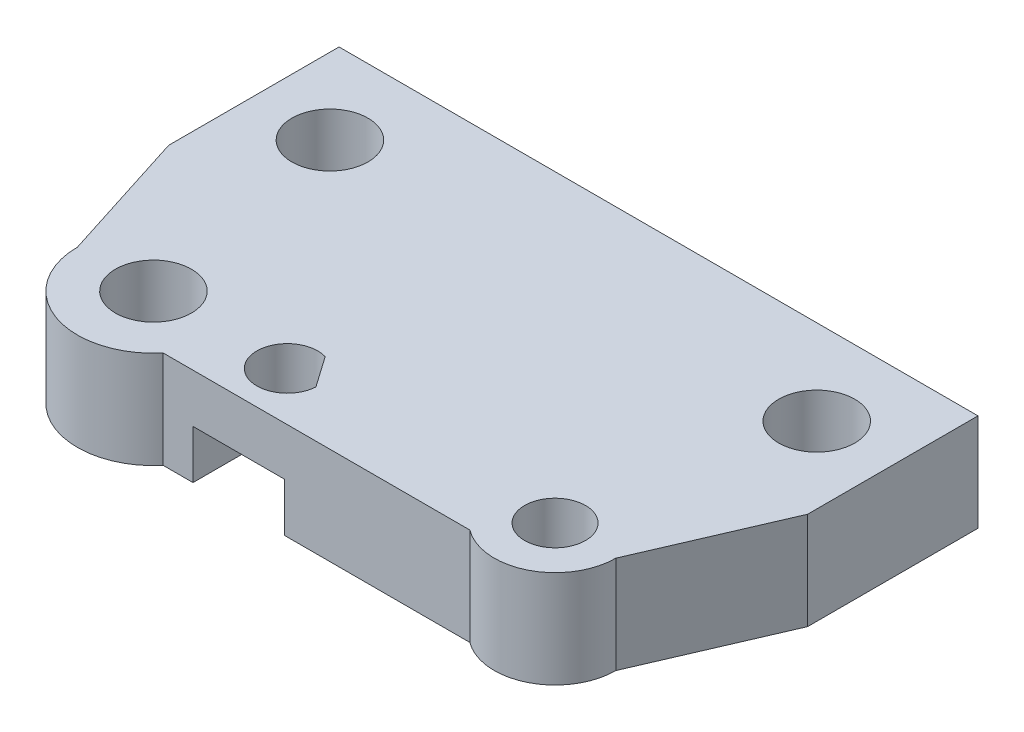
ISO-10303-21;
HEADER;
FILE_DESCRIPTION(('STEP AP214'),'2;1');
FILE_NAME('part.step','',(''),(''),'','','');
FILE_SCHEMA(('AUTOMOTIVE_DESIGN { 1 0 10303 214 1 1 1 1 }'));
ENDSEC;
DATA;
#1=APPLICATION_CONTEXT('core data for automotive mechanical design processes');
#2=APPLICATION_PROTOCOL_DEFINITION('international standard','automotive_design',2000,#1);
#3=PRODUCT_CONTEXT('',#1,'mechanical');
#4=PRODUCT('Part','Part','',(#3));
#5=PRODUCT_RELATED_PRODUCT_CATEGORY('part','',(#4));
#6=PRODUCT_DEFINITION_FORMATION('','',#4);
#7=PRODUCT_DEFINITION_CONTEXT('part definition',#1,'design');
#8=PRODUCT_DEFINITION('design','',#6,#7);
#9=PRODUCT_DEFINITION_SHAPE('','',#8);
#10=(LENGTH_UNIT() NAMED_UNIT(*) SI_UNIT(.MILLI.,.METRE.));
#11=(NAMED_UNIT(*) PLANE_ANGLE_UNIT() SI_UNIT($,.RADIAN.));
#12=(NAMED_UNIT(*) SI_UNIT($,.STERADIAN.) SOLID_ANGLE_UNIT());
#13=UNCERTAINTY_MEASURE_WITH_UNIT(LENGTH_MEASURE(1.E-05),#10,'distance_accuracy_value','');
#14=(GEOMETRIC_REPRESENTATION_CONTEXT(3) GLOBAL_UNCERTAINTY_ASSIGNED_CONTEXT((#13)) GLOBAL_UNIT_ASSIGNED_CONTEXT((#10,
#11,#12)) REPRESENTATION_CONTEXT('',''));
#15=CARTESIAN_POINT('',(0.,0.,0.));
#16=DIRECTION('',(0.,0.,1.));
#17=DIRECTION('',(1.,0.,0.));
#18=AXIS2_PLACEMENT_3D('',#15,#16,#17);
#19=CARTESIAN_POINT('',(13.97,-10.16,0.));
#20=DIRECTION('',(0.,1.,0.));
#21=DIRECTION('',(0.,0.,1.));
#22=AXIS2_PLACEMENT_3D('',#19,#20,#21);
#23=CYLINDRICAL_SURFACE('',#22,3.175);
#24=CARTESIAN_POINT('',(13.97,-5.08,0.));
#25=DIRECTION('',(0.,-1.,0.));
#26=DIRECTION('',(0.,0.,-1.));
#27=AXIS2_PLACEMENT_3D('',#24,#25,#26);
#28=CIRCLE('',#27,3.175);
#29=CARTESIAN_POINT('',(14.8785625140549,-5.08,-3.04222602021188));
#30=VERTEX_POINT('',#29);
#31=CARTESIAN_POINT('',(17.1395040232334,-5.08,0.186733089481814));
#32=VERTEX_POINT('',#31);
#33=EDGE_CURVE('E65',#30,#32,#28,.F.);
#34=ORIENTED_EDGE('',*,*,#33,.F.);
#35=DIRECTION('',(0.,1.,0.));
#36=VECTOR('',#35,1.);
#37=CARTESIAN_POINT('',(14.8785625140549,-10.16,-3.04222602021188));
#38=LINE('',#37,#36);
#39=CARTESIAN_POINT('',(14.8785625140549,0.,-3.04222602021188));
#40=VERTEX_POINT('',#39);
#41=EDGE_CURVE('E200',#30,#40,#38,.T.);
#42=ORIENTED_EDGE('',*,*,#41,.T.);
#43=CARTESIAN_POINT('',(13.97,0.,0.));
#44=DIRECTION('',(0.,1.,0.));
#45=DIRECTION('',(0.,0.,-1.));
#46=AXIS2_PLACEMENT_3D('',#43,#44,#45);
#47=CIRCLE('',#46,3.175);
#48=CARTESIAN_POINT('',(17.1395040232334,0.,0.186733089481812));
#49=VERTEX_POINT('',#48);
#50=EDGE_CURVE('E191',#40,#49,#47,.T.);
#51=ORIENTED_EDGE('',*,*,#50,.T.);
#52=DIRECTION('',(0.,1.,0.));
#53=VECTOR('',#52,1.);
#54=CARTESIAN_POINT('',(17.1395040232334,-10.16,0.186733089481814));
#55=LINE('',#54,#53);
#56=EDGE_CURVE('E199',#32,#49,#55,.T.);
#57=ORIENTED_EDGE('',*,*,#56,.F.);
#58=EDGE_LOOP('',(#34,#42,#51,#57));
#59=FACE_BOUND('',#58,.T.);
#60=ADVANCED_FACE('F43',(#59),#23,.F.);
#61=CARTESIAN_POINT('',(17.1395040232334,-10.16,0.186733089481814));
#62=DIRECTION('',(0.819152044288991,0.,-0.573576436351047));
#63=DIRECTION('',(-0.573576436351047,0.,-0.819152044288991));
#64=AXIS2_PLACEMENT_3D('',#61,#62,#63);
#65=PLANE('',#64);
#66=DIRECTION('',(-0.573576436351047,0.,-0.819152044288991));
#67=VECTOR('',#66,1.);
#68=CARTESIAN_POINT('',(17.1395040232334,-5.08,0.186733089481814));
#69=LINE('',#68,#67);
#70=EDGE_CURVE('E11',#32,#30,#69,.T.);
#71=ORIENTED_EDGE('',*,*,#70,.F.);
#72=ORIENTED_EDGE('',*,*,#56,.T.);
#73=DIRECTION('',(-0.573576436351047,0.,-0.819152044288991));
#74=VECTOR('',#73,1.);
#75=CARTESIAN_POINT('',(17.1395040232334,0.,0.186733089481814));
#76=LINE('',#75,#74);
#77=EDGE_CURVE('E195',#49,#40,#76,.T.);
#78=ORIENTED_EDGE('',*,*,#77,.T.);
#79=ORIENTED_EDGE('',*,*,#41,.F.);
#80=EDGE_LOOP('',(#71,#72,#78,#79));
#81=FACE_BOUND('',#80,.T.);
#82=ADVANCED_FACE('F375',(#81),#65,.F.);
#83=CARTESIAN_POINT('',(41.91,-10.16,0.));
#84=DIRECTION('',(0.,1.,0.));
#85=DIRECTION('',(0.,0.,1.));
#86=AXIS2_PLACEMENT_3D('',#83,#84,#85);
#87=CYLINDRICAL_SURFACE('',#86,6.35);
#88=CARTESIAN_POINT('',(41.91,0.,0.));
#89=DIRECTION('',(0.,1.,0.));
#90=DIRECTION('',(0.,0.,-1.));
#91=AXIS2_PLACEMENT_3D('',#88,#89,#90);
#92=CIRCLE('',#91,6.35);
#93=CARTESIAN_POINT('',(38.1,0.,5.08));
#94=VERTEX_POINT('',#93);
#95=CARTESIAN_POINT('',(48.26,0.,0.));
#96=VERTEX_POINT('',#95);
#97=EDGE_CURVE('E234',#94,#96,#92,.T.);
#98=ORIENTED_EDGE('',*,*,#97,.F.);
#99=DIRECTION('',(0.,1.,0.));
#100=VECTOR('',#99,1.);
#101=CARTESIAN_POINT('',(38.1,-10.16,5.08));
#102=LINE('',#101,#100);
#103=CARTESIAN_POINT('',(38.1,-10.16,5.08));
#104=VERTEX_POINT('',#103);
#105=EDGE_CURVE('E52',#104,#94,#102,.T.);
#106=ORIENTED_EDGE('',*,*,#105,.F.);
#107=CARTESIAN_POINT('',(41.91,-10.16,0.));
#108=DIRECTION('',(0.,1.,0.));
#109=DIRECTION('',(0.,0.,-1.));
#110=AXIS2_PLACEMENT_3D('',#107,#108,#109);
#111=CIRCLE('',#110,6.35);
#112=CARTESIAN_POINT('',(48.26,-10.16,0.));
#113=VERTEX_POINT('',#112);
#114=EDGE_CURVE('E238',#104,#113,#111,.T.);
#115=ORIENTED_EDGE('',*,*,#114,.T.);
#116=DIRECTION('',(0.,1.,0.));
#117=VECTOR('',#116,1.);
#118=CARTESIAN_POINT('',(48.26,-10.16,0.));
#119=LINE('',#118,#117);
#120=EDGE_CURVE('E272',#113,#96,#119,.T.);
#121=ORIENTED_EDGE('',*,*,#120,.T.);
#122=EDGE_LOOP('',(#98,#106,#115,#121));
#123=FACE_BOUND('',#122,.T.);
#124=ADVANCED_FACE('F45',(#123),#87,.T.);
#125=CARTESIAN_POINT('',(38.1,-10.16,5.08));
#126=DIRECTION('',(0.,0.,1.));
#127=DIRECTION('',(1.,0.,0.));
#128=AXIS2_PLACEMENT_3D('',#125,#126,#127);
#129=PLANE('',#128);
#130=DIRECTION('',(0.,-1.,0.));
#131=VECTOR('',#130,1.);
#132=CARTESIAN_POINT('',(9.2075,-5.08,5.07999999999999));
#133=LINE('',#132,#131);
#134=CARTESIAN_POINT('',(9.2075,-5.08,5.07999999999999));
#135=VERTEX_POINT('',#134);
#136=CARTESIAN_POINT('',(9.2075,-10.16,5.07999999999999));
#137=VERTEX_POINT('',#136);
#138=EDGE_CURVE('E184',#135,#137,#133,.T.);
#139=ORIENTED_EDGE('',*,*,#138,.F.);
#140=DIRECTION('',(-1.,0.,0.));
#141=VECTOR('',#140,1.);
#142=CARTESIAN_POINT('',(9.2075,-5.08,5.07999999999999));
#143=LINE('',#142,#141);
#144=CARTESIAN_POINT('',(18.7325,-5.08,5.07999999999999));
#145=VERTEX_POINT('',#144);
#146=EDGE_CURVE('E161',#145,#135,#143,.T.);
#147=ORIENTED_EDGE('',*,*,#146,.F.);
#148=DIRECTION('',(0.,-1.,0.));
#149=VECTOR('',#148,1.);
#150=CARTESIAN_POINT('',(18.7325,-5.08,5.07999999999999));
#151=LINE('',#150,#149);
#152=CARTESIAN_POINT('',(18.7325,-10.16,5.07999999999999));
#153=VERTEX_POINT('',#152);
#154=EDGE_CURVE('E151',#145,#153,#151,.T.);
#155=ORIENTED_EDGE('',*,*,#154,.T.);
#156=DIRECTION('',(1.,0.,0.));
#157=VECTOR('',#156,1.);
#158=CARTESIAN_POINT('',(38.1,-10.16,5.08));
#159=LINE('',#158,#157);
#160=EDGE_CURVE('E267',#153,#104,#159,.T.);
#161=ORIENTED_EDGE('',*,*,#160,.T.);
#162=ORIENTED_EDGE('',*,*,#105,.T.);
#163=DIRECTION('',(1.,0.,0.));
#164=VECTOR('',#163,1.);
#165=CARTESIAN_POINT('',(38.1,0.,5.08));
#166=LINE('',#165,#164);
#167=CARTESIAN_POINT('',(6.09897583615479,0.,5.07999999999999));
#168=VERTEX_POINT('',#167);
#169=EDGE_CURVE('E243',#168,#94,#166,.T.);
#170=ORIENTED_EDGE('',*,*,#169,.F.);
#171=DIRECTION('',(0.,1.,0.));
#172=VECTOR('',#171,1.);
#173=CARTESIAN_POINT('',(6.09897583615479,-10.16,5.07999999999999));
#174=LINE('',#173,#172);
#175=CARTESIAN_POINT('',(6.09897583615479,-10.16,5.07999999999999));
#176=VERTEX_POINT('',#175);
#177=EDGE_CURVE('E305',#176,#168,#174,.T.);
#178=ORIENTED_EDGE('',*,*,#177,.F.);
#179=EDGE_CURVE('E268',#176,#137,#159,.T.);
#180=ORIENTED_EDGE('',*,*,#179,.T.);
#181=EDGE_LOOP('',(#139,#147,#155,#161,#162,#170,#178,#180));
#182=FACE_BOUND('',#181,.T.);
#183=ADVANCED_FACE('F338',(#182),#129,.T.);
#184=CARTESIAN_POINT('',(0.,-10.16,0.));
#185=DIRECTION('',(0.,1.,0.));
#186=DIRECTION('',(0.,0.,1.));
#187=AXIS2_PLACEMENT_3D('',#184,#185,#186);
#188=CYLINDRICAL_SURFACE('',#187,7.9375);
#189=CARTESIAN_POINT('',(0.,0.,0.));
#190=DIRECTION('',(0.,1.,0.));
#191=DIRECTION('',(0.,0.,-1.));
#192=AXIS2_PLACEMENT_3D('',#189,#190,#191);
#193=CIRCLE('',#192,7.9375);
#194=CARTESIAN_POINT('',(-7.9375,0.,0.));
#195=VERTEX_POINT('',#194);
#196=EDGE_CURVE('E296',#195,#168,#193,.T.);
#197=ORIENTED_EDGE('',*,*,#196,.F.);
#198=DIRECTION('',(0.,1.,0.));
#199=VECTOR('',#198,1.);
#200=CARTESIAN_POINT('',(-7.9375,-10.16,0.));
#201=LINE('',#200,#199);
#202=CARTESIAN_POINT('',(-7.9375,-10.16,0.));
#203=VERTEX_POINT('',#202);
#204=EDGE_CURVE('E308',#203,#195,#201,.T.);
#205=ORIENTED_EDGE('',*,*,#204,.F.);
#206=CARTESIAN_POINT('',(0.,-10.16,0.));
#207=DIRECTION('',(0.,1.,0.));
#208=DIRECTION('',(0.,0.,-1.));
#209=AXIS2_PLACEMENT_3D('',#206,#207,#208);
#210=CIRCLE('',#209,7.9375);
#211=EDGE_CURVE('E263',#203,#176,#210,.T.);
#212=ORIENTED_EDGE('',*,*,#211,.T.);
#213=ORIENTED_EDGE('',*,*,#177,.T.);
#214=EDGE_LOOP('',(#197,#205,#212,#213));
#215=FACE_BOUND('',#214,.T.);
#216=ADVANCED_FACE('F361',(#215),#188,.T.);
#217=CARTESIAN_POINT('',(-7.9375,-10.16,0.));
#218=DIRECTION('',(-0.952925780013262,0.,0.303203657276947));
#219=DIRECTION('',(0.303203657276947,0.,0.952925780013262));
#220=AXIS2_PLACEMENT_3D('',#217,#218,#219);
#221=PLANE('',#220);
#222=DIRECTION('',(0.303203657276947,0.,0.952925780013262));
#223=VECTOR('',#222,1.);
#224=CARTESIAN_POINT('',(-7.9375,0.,0.));
#225=LINE('',#224,#223);
#226=CARTESIAN_POINT('',(-12.3825,0.,-13.97));
#227=VERTEX_POINT('',#226);
#228=EDGE_CURVE('E292',#227,#195,#225,.T.);
#229=ORIENTED_EDGE('',*,*,#228,.F.);
#230=DIRECTION('',(0.,1.,0.));
#231=VECTOR('',#230,1.);
#232=CARTESIAN_POINT('',(-12.3825,-10.16,-13.97));
#233=LINE('',#232,#231);
#234=CARTESIAN_POINT('',(-12.3825,-10.16,-13.97));
#235=VERTEX_POINT('',#234);
#236=EDGE_CURVE('E311',#235,#227,#233,.T.);
#237=ORIENTED_EDGE('',*,*,#236,.F.);
#238=DIRECTION('',(0.303203657276947,0.,0.952925780013262));
#239=VECTOR('',#238,1.);
#240=CARTESIAN_POINT('',(-7.9375,-10.16,0.));
#241=LINE('',#240,#239);
#242=EDGE_CURVE('E259',#235,#203,#241,.T.);
#243=ORIENTED_EDGE('',*,*,#242,.T.);
#244=ORIENTED_EDGE('',*,*,#204,.T.);
#245=EDGE_LOOP('',(#229,#237,#243,#244));
#246=FACE_BOUND('',#245,.T.);
#247=ADVANCED_FACE('F358',(#246),#221,.T.);
#248=CARTESIAN_POINT('',(-12.3825,-10.16,-31.75));
#249=DIRECTION('',(-1.,0.,0.));
#250=DIRECTION('',(0.,0.,1.));
#251=AXIS2_PLACEMENT_3D('',#248,#249,#250);
#252=PLANE('',#251);
#253=DIRECTION('',(0.,0.,1.));
#254=VECTOR('',#253,1.);
#255=CARTESIAN_POINT('',(-12.3825,0.,-31.75));
#256=LINE('',#255,#254);
#257=CARTESIAN_POINT('',(-12.3825,0.,-31.75));
#258=VERTEX_POINT('',#257);
#259=EDGE_CURVE('E288',#258,#227,#256,.T.);
#260=ORIENTED_EDGE('',*,*,#259,.F.);
#261=DIRECTION('',(0.,1.,0.));
#262=VECTOR('',#261,1.);
#263=CARTESIAN_POINT('',(-12.3825,-10.16,-31.75));
#264=LINE('',#263,#262);
#265=CARTESIAN_POINT('',(-12.3825,-10.16,-31.75));
#266=VERTEX_POINT('',#265);
#267=EDGE_CURVE('E314',#266,#258,#264,.T.);
#268=ORIENTED_EDGE('',*,*,#267,.F.);
#269=DIRECTION('',(0.,0.,1.));
#270=VECTOR('',#269,1.);
#271=CARTESIAN_POINT('',(-12.3825,-10.16,-31.75));
#272=LINE('',#271,#270);
#273=EDGE_CURVE('E255',#266,#235,#272,.T.);
#274=ORIENTED_EDGE('',*,*,#273,.T.);
#275=ORIENTED_EDGE('',*,*,#236,.T.);
#276=EDGE_LOOP('',(#260,#268,#274,#275));
#277=FACE_BOUND('',#276,.T.);
#278=ADVANCED_FACE('F354',(#277),#252,.T.);
#279=CARTESIAN_POINT('',(54.2925,-10.16,-31.75));
#280=DIRECTION('',(0.,0.,-1.));
#281=DIRECTION('',(-1.,0.,0.));
#282=AXIS2_PLACEMENT_3D('',#279,#280,#281);
#283=PLANE('',#282);
#284=DIRECTION('',(-1.,0.,0.));
#285=VECTOR('',#284,1.);
#286=CARTESIAN_POINT('',(54.2925,0.,-31.75));
#287=LINE('',#286,#285);
#288=CARTESIAN_POINT('',(54.2925,0.,-31.75));
#289=VERTEX_POINT('',#288);
#290=EDGE_CURVE('E284',#289,#258,#287,.T.);
#291=ORIENTED_EDGE('',*,*,#290,.F.);
#292=DIRECTION('',(0.,1.,0.));
#293=VECTOR('',#292,1.);
#294=CARTESIAN_POINT('',(54.2925,-10.16,-31.75));
#295=LINE('',#294,#293);
#296=CARTESIAN_POINT('',(54.2925,-10.16,-31.75));
#297=VERTEX_POINT('',#296);
#298=EDGE_CURVE('E317',#297,#289,#295,.T.);
#299=ORIENTED_EDGE('',*,*,#298,.F.);
#300=DIRECTION('',(-1.,0.,0.));
#301=VECTOR('',#300,1.);
#302=CARTESIAN_POINT('',(54.2925,-10.16,-31.75));
#303=LINE('',#302,#301);
#304=EDGE_CURVE('E251',#297,#266,#303,.T.);
#305=ORIENTED_EDGE('',*,*,#304,.T.);
#306=ORIENTED_EDGE('',*,*,#267,.T.);
#307=EDGE_LOOP('',(#291,#299,#305,#306));
#308=FACE_BOUND('',#307,.T.);
#309=ADVANCED_FACE('F352',(#308),#283,.T.);
#310=CARTESIAN_POINT('',(54.2925,-10.16,-31.75));
#311=DIRECTION('',(1.,0.,0.));
#312=DIRECTION('',(0.,0.,-1.));
#313=AXIS2_PLACEMENT_3D('',#310,#311,#312);
#314=PLANE('',#313);
#315=DIRECTION('',(0.,0.,-1.));
#316=VECTOR('',#315,1.);
#317=CARTESIAN_POINT('',(54.2925,0.,-31.75));
#318=LINE('',#317,#316);
#319=CARTESIAN_POINT('',(54.2925,0.,-13.97));
#320=VERTEX_POINT('',#319);
#321=EDGE_CURVE('E280',#320,#289,#318,.T.);
#322=ORIENTED_EDGE('',*,*,#321,.F.);
#323=DIRECTION('',(0.,1.,0.));
#324=VECTOR('',#323,1.);
#325=CARTESIAN_POINT('',(54.2925,-10.16,-13.97));
#326=LINE('',#325,#324);
#327=CARTESIAN_POINT('',(54.2925,-10.16,-13.97));
#328=VERTEX_POINT('',#327);
#329=EDGE_CURVE('E320',#328,#320,#326,.T.);
#330=ORIENTED_EDGE('',*,*,#329,.F.);
#331=DIRECTION('',(0.,0.,-1.));
#332=VECTOR('',#331,1.);
#333=CARTESIAN_POINT('',(54.2925,-10.16,-31.75));
#334=LINE('',#333,#332);
#335=EDGE_CURVE('E247',#328,#297,#334,.T.);
#336=ORIENTED_EDGE('',*,*,#335,.T.);
#337=ORIENTED_EDGE('',*,*,#298,.T.);
#338=EDGE_LOOP('',(#322,#330,#336,#337));
#339=FACE_BOUND('',#338,.T.);
#340=ADVANCED_FACE('F348',(#339),#314,.T.);
#341=CARTESIAN_POINT('',(48.26,-10.16,0.));
#342=DIRECTION('',(0.91806235353619,0.,0.396436016299719));
#343=DIRECTION('',(0.396436016299719,0.,-0.91806235353619));
#344=AXIS2_PLACEMENT_3D('',#341,#342,#343);
#345=PLANE('',#344);
#346=DIRECTION('',(0.396436016299719,0.,-0.91806235353619));
#347=VECTOR('',#346,1.);
#348=CARTESIAN_POINT('',(48.26,0.,0.));
#349=LINE('',#348,#347);
#350=EDGE_CURVE('E276',#96,#320,#349,.T.);
#351=ORIENTED_EDGE('',*,*,#350,.F.);
#352=ORIENTED_EDGE('',*,*,#120,.F.);
#353=DIRECTION('',(0.396436016299719,0.,-0.91806235353619));
#354=VECTOR('',#353,1.);
#355=CARTESIAN_POINT('',(48.26,-10.16,0.));
#356=LINE('',#355,#354);
#357=EDGE_CURVE('E242',#113,#328,#356,.T.);
#358=ORIENTED_EDGE('',*,*,#357,.T.);
#359=ORIENTED_EDGE('',*,*,#329,.T.);
#360=EDGE_LOOP('',(#351,#352,#358,#359));
#361=FACE_BOUND('',#360,.T.);
#362=ADVANCED_FACE('F330',(#361),#345,.T.);
#363=CARTESIAN_POINT('',(41.91,-10.16,0.));
#364=DIRECTION('',(0.,-1.,0.));
#365=DIRECTION('',(0.,0.,-1.));
#366=AXIS2_PLACEMENT_3D('',#363,#364,#365);
#367=PLANE('',#366);
#368=DIRECTION('',(0.,0.,-1.));
#369=VECTOR('',#368,1.);
#370=CARTESIAN_POINT('',(9.2075,-10.16,0.));
#371=LINE('',#370,#369);
#372=CARTESIAN_POINT('',(9.2075,-10.16,0.));
#373=VERTEX_POINT('',#372);
#374=EDGE_CURVE('E166',#137,#373,#371,.T.);
#375=ORIENTED_EDGE('',*,*,#374,.F.);
#376=ORIENTED_EDGE('',*,*,#179,.F.);
#377=ORIENTED_EDGE('',*,*,#211,.F.);
#378=ORIENTED_EDGE('',*,*,#242,.F.);
#379=ORIENTED_EDGE('',*,*,#273,.F.);
#380=ORIENTED_EDGE('',*,*,#304,.F.);
#381=ORIENTED_EDGE('',*,*,#335,.F.);
#382=ORIENTED_EDGE('',*,*,#357,.F.);
#383=ORIENTED_EDGE('',*,*,#114,.F.);
#384=ORIENTED_EDGE('',*,*,#160,.F.);
#385=DIRECTION('',(0.,0.,1.));
#386=VECTOR('',#385,1.);
#387=CARTESIAN_POINT('',(18.7325,-10.16,5.07999999999999));
#388=LINE('',#387,#386);
#389=CARTESIAN_POINT('',(18.7325,-10.16,0.));
#390=VERTEX_POINT('',#389);
#391=EDGE_CURVE('E170',#390,#153,#388,.T.);
#392=ORIENTED_EDGE('',*,*,#391,.F.);
#393=CARTESIAN_POINT('',(13.97,-10.16,0.));
#394=DIRECTION('',(0.,-1.,0.));
#395=DIRECTION('',(0.,0.,-1.));
#396=AXIS2_PLACEMENT_3D('',#393,#394,#395);
#397=CIRCLE('',#396,4.7625);
#398=EDGE_CURVE('E59',#373,#390,#397,.T.);
#399=ORIENTED_EDGE('',*,*,#398,.F.);
#400=EDGE_LOOP('',(#375,#376,#377,#378,#379,#380,#381,#382,#383,#384,#392,#399));
#401=FACE_BOUND('',#400,.T.);
#402=CARTESIAN_POINT('',(-4.445,-10.16,-22.86));
#403=DIRECTION('',(0.,1.,0.));
#404=DIRECTION('',(0.,0.,1.));
#405=AXIS2_PLACEMENT_3D('',#402,#403,#404);
#406=CIRCLE('',#405,3.96875);
#407=CARTESIAN_POINT('',(-4.445,-10.16,-18.89125));
#408=VERTEX_POINT('',#407);
#409=EDGE_CURVE('E206',#408,#408,#406,.T.);
#410=ORIENTED_EDGE('',*,*,#409,.T.);
#411=EDGE_LOOP('',(#410));
#412=FACE_BOUND('',#411,.T.);
#413=CARTESIAN_POINT('',(46.355,-10.16,-22.86));
#414=DIRECTION('',(0.,1.,0.));
#415=DIRECTION('',(0.,0.,1.));
#416=AXIS2_PLACEMENT_3D('',#413,#414,#415);
#417=CIRCLE('',#416,3.96875000000001);
#418=CARTESIAN_POINT('',(46.355,-10.16,-18.89125));
#419=VERTEX_POINT('',#418);
#420=EDGE_CURVE('E214',#419,#419,#417,.T.);
#421=ORIENTED_EDGE('',*,*,#420,.T.);
#422=EDGE_LOOP('',(#421));
#423=FACE_BOUND('',#422,.T.);
#424=CARTESIAN_POINT('',(41.91,-10.16,0.));
#425=DIRECTION('',(0.,1.,0.));
#426=DIRECTION('',(0.,0.,1.));
#427=AXIS2_PLACEMENT_3D('',#424,#425,#426);
#428=CIRCLE('',#427,3.175);
#429=CARTESIAN_POINT('',(41.91,-10.16,3.175));
#430=VERTEX_POINT('',#429);
#431=EDGE_CURVE('E222',#430,#430,#428,.T.);
#432=ORIENTED_EDGE('',*,*,#431,.T.);
#433=EDGE_LOOP('',(#432));
#434=FACE_BOUND('',#433,.T.);
#435=CARTESIAN_POINT('',(0.,-10.16,0.));
#436=DIRECTION('',(0.,1.,0.));
#437=DIRECTION('',(0.,0.,1.));
#438=AXIS2_PLACEMENT_3D('',#435,#436,#437);
#439=CIRCLE('',#438,3.96875);
#440=CARTESIAN_POINT('',(0.,-10.16,3.96875));
#441=VERTEX_POINT('',#440);
#442=EDGE_CURVE('E230',#441,#441,#439,.T.);
#443=ORIENTED_EDGE('',*,*,#442,.T.);
#444=EDGE_LOOP('',(#443));
#445=FACE_BOUND('',#444,.T.);
#446=ADVANCED_FACE('F342',(#401,#412,#423,#434,#445),#367,.T.);
#447=CARTESIAN_POINT('',(41.91,0.,0.));
#448=DIRECTION('',(0.,-1.,0.));
#449=DIRECTION('',(0.,0.,-1.));
#450=AXIS2_PLACEMENT_3D('',#447,#448,#449);
#451=PLANE('',#450);
#452=ORIENTED_EDGE('',*,*,#77,.F.);
#453=ORIENTED_EDGE('',*,*,#50,.F.);
#454=EDGE_LOOP('',(#452,#453));
#455=FACE_BOUND('',#454,.T.);
#456=CARTESIAN_POINT('',(-4.445,0.,-22.86));
#457=DIRECTION('',(0.,1.,0.));
#458=DIRECTION('',(0.,0.,1.));
#459=AXIS2_PLACEMENT_3D('',#456,#457,#458);
#460=CIRCLE('',#459,3.96875);
#461=CARTESIAN_POINT('',(-4.445,0.,-18.89125));
#462=VERTEX_POINT('',#461);
#463=EDGE_CURVE('E203',#462,#462,#460,.T.);
#464=ORIENTED_EDGE('',*,*,#463,.F.);
#465=EDGE_LOOP('',(#464));
#466=FACE_BOUND('',#465,.T.);
#467=CARTESIAN_POINT('',(46.355,0.,-22.86));
#468=DIRECTION('',(0.,1.,0.));
#469=DIRECTION('',(0.,0.,1.));
#470=AXIS2_PLACEMENT_3D('',#467,#468,#469);
#471=CIRCLE('',#470,3.96875000000001);
#472=CARTESIAN_POINT('',(46.355,0.,-18.89125));
#473=VERTEX_POINT('',#472);
#474=EDGE_CURVE('E210',#473,#473,#471,.T.);
#475=ORIENTED_EDGE('',*,*,#474,.F.);
#476=EDGE_LOOP('',(#475));
#477=FACE_BOUND('',#476,.T.);
#478=CARTESIAN_POINT('',(41.91,0.,0.));
#479=DIRECTION('',(0.,1.,0.));
#480=DIRECTION('',(0.,0.,1.));
#481=AXIS2_PLACEMENT_3D('',#478,#479,#480);
#482=CIRCLE('',#481,3.175);
#483=CARTESIAN_POINT('',(41.91,0.,3.175));
#484=VERTEX_POINT('',#483);
#485=EDGE_CURVE('E218',#484,#484,#482,.T.);
#486=ORIENTED_EDGE('',*,*,#485,.F.);
#487=EDGE_LOOP('',(#486));
#488=FACE_BOUND('',#487,.T.);
#489=CARTESIAN_POINT('',(0.,0.,0.));
#490=DIRECTION('',(0.,1.,0.));
#491=DIRECTION('',(0.,0.,1.));
#492=AXIS2_PLACEMENT_3D('',#489,#490,#491);
#493=CIRCLE('',#492,3.96875);
#494=CARTESIAN_POINT('',(0.,0.,3.96875));
#495=VERTEX_POINT('',#494);
#496=EDGE_CURVE('E226',#495,#495,#493,.T.);
#497=ORIENTED_EDGE('',*,*,#496,.F.);
#498=EDGE_LOOP('',(#497));
#499=FACE_BOUND('',#498,.T.);
#500=ORIENTED_EDGE('',*,*,#97,.T.);
#501=ORIENTED_EDGE('',*,*,#350,.T.);
#502=ORIENTED_EDGE('',*,*,#321,.T.);
#503=ORIENTED_EDGE('',*,*,#290,.T.);
#504=ORIENTED_EDGE('',*,*,#259,.T.);
#505=ORIENTED_EDGE('',*,*,#228,.T.);
#506=ORIENTED_EDGE('',*,*,#196,.T.);
#507=ORIENTED_EDGE('',*,*,#169,.T.);
#508=EDGE_LOOP('',(#500,#501,#502,#503,#504,#505,#506,#507));
#509=FACE_BOUND('',#508,.T.);
#510=ADVANCED_FACE('F333',(#455,#466,#477,#488,#499,#509),#451,.F.);
#511=CARTESIAN_POINT('',(0.,-10.16,0.));
#512=DIRECTION('',(0.,1.,0.));
#513=DIRECTION('',(0.,0.,1.));
#514=AXIS2_PLACEMENT_3D('',#511,#512,#513);
#515=CYLINDRICAL_SURFACE('',#514,3.96875);
#516=ORIENTED_EDGE('',*,*,#442,.F.);
#517=EDGE_LOOP('',(#516));
#518=FACE_BOUND('',#517,.T.);
#519=ORIENTED_EDGE('',*,*,#496,.T.);
#520=EDGE_LOOP('',(#519));
#521=FACE_BOUND('',#520,.T.);
#522=ADVANCED_FACE('F395',(#518,#521),#515,.F.);
#523=CARTESIAN_POINT('',(41.91,-10.16,0.));
#524=DIRECTION('',(0.,1.,0.));
#525=DIRECTION('',(0.,0.,1.));
#526=AXIS2_PLACEMENT_3D('',#523,#524,#525);
#527=CYLINDRICAL_SURFACE('',#526,3.175);
#528=ORIENTED_EDGE('',*,*,#431,.F.);
#529=EDGE_LOOP('',(#528));
#530=FACE_BOUND('',#529,.T.);
#531=ORIENTED_EDGE('',*,*,#485,.T.);
#532=EDGE_LOOP('',(#531));
#533=FACE_BOUND('',#532,.T.);
#534=ADVANCED_FACE('F391',(#530,#533),#527,.F.);
#535=CARTESIAN_POINT('',(46.355,-10.16,-22.86));
#536=DIRECTION('',(0.,1.,0.));
#537=DIRECTION('',(0.,0.,1.));
#538=AXIS2_PLACEMENT_3D('',#535,#536,#537);
#539=CYLINDRICAL_SURFACE('',#538,3.96875000000001);
#540=ORIENTED_EDGE('',*,*,#420,.F.);
#541=EDGE_LOOP('',(#540));
#542=FACE_BOUND('',#541,.T.);
#543=ORIENTED_EDGE('',*,*,#474,.T.);
#544=EDGE_LOOP('',(#543));
#545=FACE_BOUND('',#544,.T.);
#546=ADVANCED_FACE('F387',(#542,#545),#539,.F.);
#547=CARTESIAN_POINT('',(-4.445,-10.16,-22.86));
#548=DIRECTION('',(0.,1.,0.));
#549=DIRECTION('',(0.,0.,1.));
#550=AXIS2_PLACEMENT_3D('',#547,#548,#549);
#551=CYLINDRICAL_SURFACE('',#550,3.96875);
#552=ORIENTED_EDGE('',*,*,#409,.F.);
#553=EDGE_LOOP('',(#552));
#554=FACE_BOUND('',#553,.T.);
#555=ORIENTED_EDGE('',*,*,#463,.T.);
#556=EDGE_LOOP('',(#555));
#557=FACE_BOUND('',#556,.T.);
#558=ADVANCED_FACE('F384',(#554,#557),#551,.F.);
#559=CARTESIAN_POINT('',(13.97,-5.08,0.));
#560=DIRECTION('',(0.,-1.,0.));
#561=DIRECTION('',(0.,0.,-1.));
#562=AXIS2_PLACEMENT_3D('',#559,#560,#561);
#563=PLANE('',#562);
#564=CARTESIAN_POINT('',(13.97,-5.08,0.));
#565=DIRECTION('',(0.,-1.,0.));
#566=DIRECTION('',(0.,0.,-1.));
#567=AXIS2_PLACEMENT_3D('',#564,#565,#566);
#568=CIRCLE('',#567,4.7625);
#569=CARTESIAN_POINT('',(9.2075,-5.08,0.));
#570=VERTEX_POINT('',#569);
#571=CARTESIAN_POINT('',(18.7325,-5.08,0.));
#572=VERTEX_POINT('',#571);
#573=EDGE_CURVE('E146',#570,#572,#568,.T.);
#574=ORIENTED_EDGE('',*,*,#573,.T.);
#575=DIRECTION('',(0.,0.,1.));
#576=VECTOR('',#575,1.);
#577=CARTESIAN_POINT('',(18.7325,-5.08,5.07999999999999));
#578=LINE('',#577,#576);
#579=EDGE_CURVE('E155',#572,#145,#578,.T.);
#580=ORIENTED_EDGE('',*,*,#579,.T.);
#581=ORIENTED_EDGE('',*,*,#146,.T.);
#582=DIRECTION('',(0.,0.,-1.));
#583=VECTOR('',#582,1.);
#584=CARTESIAN_POINT('',(9.2075,-5.08,0.));
#585=LINE('',#584,#583);
#586=EDGE_CURVE('E152',#135,#570,#585,.T.);
#587=ORIENTED_EDGE('',*,*,#586,.T.);
#588=EDGE_LOOP('',(#574,#580,#581,#587));
#589=FACE_BOUND('',#588,.T.);
#590=ORIENTED_EDGE('',*,*,#33,.T.);
#591=ORIENTED_EDGE('',*,*,#70,.T.);
#592=EDGE_LOOP('',(#590,#591));
#593=FACE_BOUND('',#592,.T.);
#594=ADVANCED_FACE('F163',(#589,#593),#563,.T.);
#595=CARTESIAN_POINT('',(13.97,-5.08,0.));
#596=DIRECTION('',(0.,-1.,0.));
#597=DIRECTION('',(0.,0.,-1.));
#598=AXIS2_PLACEMENT_3D('',#595,#596,#597);
#599=CYLINDRICAL_SURFACE('',#598,4.7625);
#600=ORIENTED_EDGE('',*,*,#398,.T.);
#601=DIRECTION('',(0.,-1.,0.));
#602=VECTOR('',#601,1.);
#603=CARTESIAN_POINT('',(18.7325,-5.08,0.));
#604=LINE('',#603,#602);
#605=EDGE_CURVE('E142',#572,#390,#604,.T.);
#606=ORIENTED_EDGE('',*,*,#605,.F.);
#607=ORIENTED_EDGE('',*,*,#573,.F.);
#608=DIRECTION('',(0.,-1.,0.));
#609=VECTOR('',#608,1.);
#610=CARTESIAN_POINT('',(9.2075,-5.08,0.));
#611=LINE('',#610,#609);
#612=EDGE_CURVE('E181',#570,#373,#611,.T.);
#613=ORIENTED_EDGE('',*,*,#612,.T.);
#614=EDGE_LOOP('',(#600,#606,#607,#613));
#615=FACE_BOUND('',#614,.T.);
#616=ADVANCED_FACE('F144',(#615),#599,.F.);
#617=CARTESIAN_POINT('',(9.2075,-5.08,0.));
#618=DIRECTION('',(-1.,0.,0.));
#619=DIRECTION('',(0.,0.,1.));
#620=AXIS2_PLACEMENT_3D('',#617,#618,#619);
#621=PLANE('',#620);
#622=ORIENTED_EDGE('',*,*,#374,.T.);
#623=ORIENTED_EDGE('',*,*,#612,.F.);
#624=ORIENTED_EDGE('',*,*,#586,.F.);
#625=ORIENTED_EDGE('',*,*,#138,.T.);
#626=EDGE_LOOP('',(#622,#623,#624,#625));
#627=FACE_BOUND('',#626,.T.);
#628=ADVANCED_FACE('F364',(#627),#621,.F.);
#629=CARTESIAN_POINT('',(18.7325,-5.08,5.07999999999999));
#630=DIRECTION('',(1.,0.,0.));
#631=DIRECTION('',(0.,0.,-1.));
#632=AXIS2_PLACEMENT_3D('',#629,#630,#631);
#633=PLANE('',#632);
#634=ORIENTED_EDGE('',*,*,#391,.T.);
#635=ORIENTED_EDGE('',*,*,#154,.F.);
#636=ORIENTED_EDGE('',*,*,#579,.F.);
#637=ORIENTED_EDGE('',*,*,#605,.T.);
#638=EDGE_LOOP('',(#634,#635,#636,#637));
#639=FACE_BOUND('',#638,.T.);
#640=ADVANCED_FACE('F156',(#639),#633,.F.);
#641=CLOSED_SHELL('',(#60,#82,#124,#183,#216,#247,#278,#309,#340,#362,#446,#510,#522,#534,#546,
#558,#594,#616,#628,#640));
#642=MANIFOLD_SOLID_BREP('B2',#641);
#643=ADVANCED_BREP_SHAPE_REPRESENTATION('',(#18,#642),#14);
#644=SHAPE_DEFINITION_REPRESENTATION(#9,#643);
ENDSEC;
END-ISO-10303-21;
